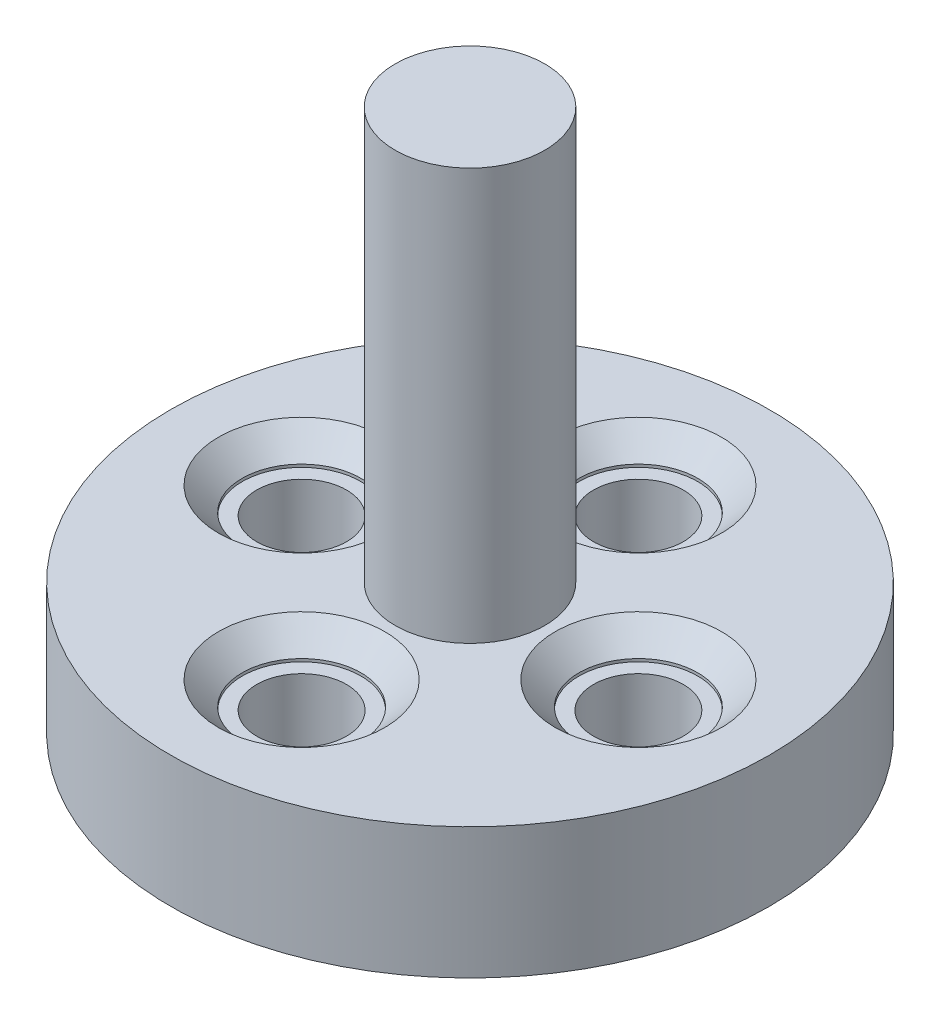
ISO-10303-21;
HEADER;
FILE_DESCRIPTION(('STEP AP214'),'2;1');
FILE_NAME('part.step','',(''),(''),'','','');
FILE_SCHEMA(('AUTOMOTIVE_DESIGN { 1 0 10303 214 1 1 1 1 }'));
ENDSEC;
DATA;
#1=APPLICATION_CONTEXT('core data for automotive mechanical design processes');
#2=APPLICATION_PROTOCOL_DEFINITION('international standard','automotive_design',2000,#1);
#3=PRODUCT_CONTEXT('',#1,'mechanical');
#4=PRODUCT('Part','Part','',(#3));
#5=PRODUCT_RELATED_PRODUCT_CATEGORY('part','',(#4));
#6=PRODUCT_DEFINITION_FORMATION('','',#4);
#7=PRODUCT_DEFINITION_CONTEXT('part definition',#1,'design');
#8=PRODUCT_DEFINITION('design','',#6,#7);
#9=PRODUCT_DEFINITION_SHAPE('','',#8);
#10=(LENGTH_UNIT() NAMED_UNIT(*) SI_UNIT(.MILLI.,.METRE.));
#11=(NAMED_UNIT(*) PLANE_ANGLE_UNIT() SI_UNIT($,.RADIAN.));
#12=(NAMED_UNIT(*) SI_UNIT($,.STERADIAN.) SOLID_ANGLE_UNIT());
#13=UNCERTAINTY_MEASURE_WITH_UNIT(LENGTH_MEASURE(1.E-05),#10,'distance_accuracy_value','');
#14=(GEOMETRIC_REPRESENTATION_CONTEXT(3) GLOBAL_UNCERTAINTY_ASSIGNED_CONTEXT((#13)) GLOBAL_UNIT_ASSIGNED_CONTEXT((#10,
#11,#12)) REPRESENTATION_CONTEXT('',''));
#15=CARTESIAN_POINT('',(0.,0.,0.));
#16=DIRECTION('',(0.,0.,1.));
#17=DIRECTION('',(1.,0.,0.));
#18=AXIS2_PLACEMENT_3D('',#15,#16,#17);
#19=CARTESIAN_POINT('',(-3.81373626373626,6.85,0.));
#20=DIRECTION('',(0.,-1.,0.));
#21=DIRECTION('',(1.,0.,0.));
#22=AXIS2_PLACEMENT_3D('',#19,#20,#21);
#23=PLANE('',#22);
#24=CARTESIAN_POINT('',(-5.81373626373626,6.85,0.));
#25=DIRECTION('',(0.,1.,0.));
#26=DIRECTION('',(-1.,0.,0.));
#27=AXIS2_PLACEMENT_3D('',#24,#25,#26);
#28=CIRCLE('',#27,2.);
#29=CARTESIAN_POINT('',(-7.81373626373626,6.85,0.));
#30=VERTEX_POINT('',#29);
#31=EDGE_CURVE('E113',#30,#30,#28,.T.);
#32=ORIENTED_EDGE('',*,*,#31,.T.);
#33=EDGE_LOOP('',(#32));
#34=FACE_BOUND('',#33,.T.);
#35=ADVANCED_FACE('F42',(#34),#23,.F.);
#36=CARTESIAN_POINT('',(-5.81373626373626,-7.65,0.));
#37=DIRECTION('',(0.,1.,0.));
#38=DIRECTION('',(-1.,0.,0.));
#39=AXIS2_PLACEMENT_3D('',#36,#37,#38);
#40=PLANE('',#39);
#41=CARTESIAN_POINT('',(-5.81373626373626,-7.65,0.));
#42=DIRECTION('',(0.,-1.,0.));
#43=DIRECTION('',(1.,0.,0.));
#44=AXIS2_PLACEMENT_3D('',#41,#42,#43);
#45=CIRCLE('',#44,1.26674120256926);
#46=CARTESIAN_POINT('',(-4.546995061167,-7.65,0.));
#47=VERTEX_POINT('',#46);
#48=EDGE_CURVE('E220',#47,#47,#45,.T.);
#49=ORIENTED_EDGE('',*,*,#48,.F.);
#50=EDGE_LOOP('',(#49));
#51=FACE_BOUND('',#50,.T.);
#52=CARTESIAN_POINT('',(-10.3137362637363,-7.65,0.));
#53=DIRECTION('',(0.,1.,0.));
#54=DIRECTION('',(-1.,0.,0.));
#55=AXIS2_PLACEMENT_3D('',#52,#53,#54);
#56=CIRCLE('',#55,1.2);
#57=CARTESIAN_POINT('',(-11.5137362637363,-7.65,0.));
#58=VERTEX_POINT('',#57);
#59=EDGE_CURVE('E62',#58,#58,#56,.T.);
#60=ORIENTED_EDGE('',*,*,#59,.T.);
#61=EDGE_LOOP('',(#60));
#62=FACE_BOUND('',#61,.T.);
#63=CARTESIAN_POINT('',(-5.81373626373626,-7.65,-4.5));
#64=DIRECTION('',(0.,1.,0.));
#65=DIRECTION('',(-1.,0.,0.));
#66=AXIS2_PLACEMENT_3D('',#63,#64,#65);
#67=CIRCLE('',#66,1.2);
#68=CARTESIAN_POINT('',(-7.01373626373626,-7.65,-4.5));
#69=VERTEX_POINT('',#68);
#70=EDGE_CURVE('E229',#69,#69,#67,.T.);
#71=ORIENTED_EDGE('',*,*,#70,.T.);
#72=EDGE_LOOP('',(#71));
#73=FACE_BOUND('',#72,.T.);
#74=CARTESIAN_POINT('',(-1.31373626373626,-7.65,0.));
#75=DIRECTION('',(0.,1.,0.));
#76=DIRECTION('',(-1.,0.,0.));
#77=AXIS2_PLACEMENT_3D('',#74,#75,#76);
#78=CIRCLE('',#77,1.2);
#79=CARTESIAN_POINT('',(-2.51373626373626,-7.65,0.));
#80=VERTEX_POINT('',#79);
#81=EDGE_CURVE('E223',#80,#80,#78,.T.);
#82=ORIENTED_EDGE('',*,*,#81,.T.);
#83=EDGE_LOOP('',(#82));
#84=FACE_BOUND('',#83,.T.);
#85=CARTESIAN_POINT('',(-5.81373626373626,-7.65,4.5));
#86=DIRECTION('',(0.,1.,0.));
#87=DIRECTION('',(-1.,0.,0.));
#88=AXIS2_PLACEMENT_3D('',#85,#86,#87);
#89=CIRCLE('',#88,1.2);
#90=CARTESIAN_POINT('',(-7.01373626373626,-7.65,4.5));
#91=VERTEX_POINT('',#90);
#92=EDGE_CURVE('E81',#91,#91,#89,.T.);
#93=ORIENTED_EDGE('',*,*,#92,.T.);
#94=EDGE_LOOP('',(#93));
#95=FACE_BOUND('',#94,.T.);
#96=CARTESIAN_POINT('',(-5.81373626373626,-7.65,0.));
#97=DIRECTION('',(0.,1.,0.));
#98=DIRECTION('',(-1.,0.,0.));
#99=AXIS2_PLACEMENT_3D('',#96,#97,#98);
#100=CIRCLE('',#99,8.);
#101=CARTESIAN_POINT('',(-13.8137362637363,-7.65,0.));
#102=VERTEX_POINT('',#101);
#103=EDGE_CURVE('E10',#102,#102,#100,.T.);
#104=ORIENTED_EDGE('',*,*,#103,.F.);
#105=EDGE_LOOP('',(#104));
#106=FACE_BOUND('',#105,.T.);
#107=ADVANCED_FACE('F129',(#51,#62,#73,#84,#95,#106),#40,.F.);
#108=CARTESIAN_POINT('',(-5.81373626373626,6.85,0.));
#109=DIRECTION('',(0.,1.,0.));
#110=DIRECTION('',(-1.,0.,0.));
#111=AXIS2_PLACEMENT_3D('',#108,#109,#110);
#112=CYLINDRICAL_SURFACE('',#111,8.);
#113=CARTESIAN_POINT('',(-5.81373626373626,-4.15,0.));
#114=DIRECTION('',(0.,1.,0.));
#115=DIRECTION('',(-1.,0.,0.));
#116=AXIS2_PLACEMENT_3D('',#113,#114,#115);
#117=CIRCLE('',#116,8.);
#118=CARTESIAN_POINT('',(-13.8137362637363,-4.15,0.));
#119=VERTEX_POINT('',#118);
#120=EDGE_CURVE('E49',#119,#119,#117,.T.);
#121=ORIENTED_EDGE('',*,*,#120,.F.);
#122=EDGE_LOOP('',(#121));
#123=FACE_BOUND('',#122,.T.);
#124=ORIENTED_EDGE('',*,*,#103,.T.);
#125=EDGE_LOOP('',(#124));
#126=FACE_BOUND('',#125,.T.);
#127=ADVANCED_FACE('F123',(#123,#126),#112,.T.);
#128=CARTESIAN_POINT('',(2.18626373626374,-4.15,0.));
#129=DIRECTION('',(0.,-1.,0.));
#130=DIRECTION('',(1.,0.,0.));
#131=AXIS2_PLACEMENT_3D('',#128,#129,#130);
#132=PLANE('',#131);
#133=CARTESIAN_POINT('',(-10.3137362637363,-4.15,0.));
#134=DIRECTION('',(0.,1.,0.));
#135=DIRECTION('',(0.,0.,1.));
#136=AXIS2_PLACEMENT_3D('',#133,#134,#135);
#137=CIRCLE('',#136,2.2225);
#138=CARTESIAN_POINT('',(-10.3137362637363,-4.15,2.2225));
#139=VERTEX_POINT('',#138);
#140=EDGE_CURVE('E69',#139,#139,#137,.T.);
#141=ORIENTED_EDGE('',*,*,#140,.F.);
#142=EDGE_LOOP('',(#141));
#143=FACE_BOUND('',#142,.T.);
#144=CARTESIAN_POINT('',(-5.81373626373626,-4.15,-4.5));
#145=DIRECTION('',(0.,1.,0.));
#146=DIRECTION('',(0.,0.,1.));
#147=AXIS2_PLACEMENT_3D('',#144,#145,#146);
#148=CIRCLE('',#147,2.2225);
#149=CARTESIAN_POINT('',(-5.81373626373626,-4.15,-2.2775));
#150=VERTEX_POINT('',#149);
#151=EDGE_CURVE('E86',#150,#150,#148,.T.);
#152=ORIENTED_EDGE('',*,*,#151,.F.);
#153=EDGE_LOOP('',(#152));
#154=FACE_BOUND('',#153,.T.);
#155=CARTESIAN_POINT('',(-1.31373626373626,-4.15,0.));
#156=DIRECTION('',(0.,1.,0.));
#157=DIRECTION('',(0.,0.,1.));
#158=AXIS2_PLACEMENT_3D('',#155,#156,#157);
#159=CIRCLE('',#158,2.2225);
#160=CARTESIAN_POINT('',(-1.31373626373626,-4.15,2.2225));
#161=VERTEX_POINT('',#160);
#162=EDGE_CURVE('E95',#161,#161,#159,.T.);
#163=ORIENTED_EDGE('',*,*,#162,.F.);
#164=EDGE_LOOP('',(#163));
#165=FACE_BOUND('',#164,.T.);
#166=CARTESIAN_POINT('',(-5.81373626373626,-4.15,4.5));
#167=DIRECTION('',(0.,1.,0.));
#168=DIRECTION('',(0.,0.,1.));
#169=AXIS2_PLACEMENT_3D('',#166,#167,#168);
#170=CIRCLE('',#169,2.2225);
#171=CARTESIAN_POINT('',(-5.81373626373626,-4.15,6.7225));
#172=VERTEX_POINT('',#171);
#173=EDGE_CURVE('E104',#172,#172,#170,.T.);
#174=ORIENTED_EDGE('',*,*,#173,.F.);
#175=EDGE_LOOP('',(#174));
#176=FACE_BOUND('',#175,.T.);
#177=CARTESIAN_POINT('',(-5.81373626373626,-4.15,0.));
#178=DIRECTION('',(0.,1.,0.));
#179=DIRECTION('',(-1.,0.,0.));
#180=AXIS2_PLACEMENT_3D('',#177,#178,#179);
#181=CIRCLE('',#180,2.);
#182=CARTESIAN_POINT('',(-7.81373626373626,-4.15,0.));
#183=VERTEX_POINT('',#182);
#184=EDGE_CURVE('E54',#183,#183,#181,.T.);
#185=ORIENTED_EDGE('',*,*,#184,.F.);
#186=EDGE_LOOP('',(#185));
#187=FACE_BOUND('',#186,.T.);
#188=ORIENTED_EDGE('',*,*,#120,.T.);
#189=EDGE_LOOP('',(#188));
#190=FACE_BOUND('',#189,.T.);
#191=ADVANCED_FACE('F120',(#143,#154,#165,#176,#187,#190),#132,.F.);
#192=CARTESIAN_POINT('',(-5.81373626373626,6.85,0.));
#193=DIRECTION('',(0.,1.,0.));
#194=DIRECTION('',(-1.,0.,0.));
#195=AXIS2_PLACEMENT_3D('',#192,#193,#194);
#196=CYLINDRICAL_SURFACE('',#195,2.);
#197=ORIENTED_EDGE('',*,*,#31,.F.);
#198=EDGE_LOOP('',(#197));
#199=FACE_BOUND('',#198,.T.);
#200=ORIENTED_EDGE('',*,*,#184,.T.);
#201=EDGE_LOOP('',(#200));
#202=FACE_BOUND('',#201,.T.);
#203=ADVANCED_FACE('F118',(#199,#202),#196,.T.);
#204=CARTESIAN_POINT('',(-5.11523626373626,-4.8612,4.5));
#205=DIRECTION('',(0.,-1.,0.));
#206=DIRECTION('',(0.,0.,-1.));
#207=AXIS2_PLACEMENT_3D('',#204,#205,#206);
#208=PLANE('',#207);
#209=CARTESIAN_POINT('',(-5.81373626373626,-4.8612,4.5));
#210=DIRECTION('',(0.,-1.,0.));
#211=DIRECTION('',(0.,0.,-1.));
#212=AXIS2_PLACEMENT_3D('',#209,#210,#211);
#213=CIRCLE('',#212,1.2);
#214=CARTESIAN_POINT('',(-7.01373626373626,-4.8612,4.5));
#215=VERTEX_POINT('',#214);
#216=EDGE_CURVE('E45',#215,#215,#213,.T.);
#217=ORIENTED_EDGE('',*,*,#216,.T.);
#218=EDGE_LOOP('',(#217));
#219=FACE_BOUND('',#218,.T.);
#220=CARTESIAN_POINT('',(-5.81373626373626,-4.8612,4.5));
#221=DIRECTION('',(0.,1.,0.));
#222=DIRECTION('',(0.,0.,1.));
#223=AXIS2_PLACEMENT_3D('',#220,#221,#222);
#224=CIRCLE('',#223,1.5875);
#225=CARTESIAN_POINT('',(-5.81373626373626,-4.8612,6.0875));
#226=VERTEX_POINT('',#225);
#227=EDGE_CURVE('E110',#226,#226,#224,.T.);
#228=ORIENTED_EDGE('',*,*,#227,.T.);
#229=EDGE_LOOP('',(#228));
#230=FACE_BOUND('',#229,.T.);
#231=ADVANCED_FACE('F142',(#219,#230),#208,.F.);
#232=CARTESIAN_POINT('',(-5.81373626373626,-4.15,4.5));
#233=DIRECTION('',(0.,1.,0.));
#234=DIRECTION('',(0.,0.,1.));
#235=AXIS2_PLACEMENT_3D('',#232,#233,#234);
#236=CYLINDRICAL_SURFACE('',#235,1.5875);
#237=ORIENTED_EDGE('',*,*,#227,.F.);
#238=EDGE_LOOP('',(#237));
#239=FACE_BOUND('',#238,.T.);
#240=CARTESIAN_POINT('',(-5.81373626373626,-4.785,4.5));
#241=DIRECTION('',(0.,1.,0.));
#242=DIRECTION('',(0.,0.,1.));
#243=AXIS2_PLACEMENT_3D('',#240,#241,#242);
#244=CIRCLE('',#243,1.5875);
#245=CARTESIAN_POINT('',(-5.81373626373626,-4.785,6.0875));
#246=VERTEX_POINT('',#245);
#247=EDGE_CURVE('E107',#246,#246,#244,.T.);
#248=ORIENTED_EDGE('',*,*,#247,.T.);
#249=EDGE_LOOP('',(#248));
#250=FACE_BOUND('',#249,.T.);
#251=ADVANCED_FACE('F147',(#239,#250),#236,.F.);
#252=CARTESIAN_POINT('',(-5.81373626373626,-4.15,4.5));
#253=DIRECTION('',(0.,1.,0.));
#254=DIRECTION('',(0.,0.,1.));
#255=AXIS2_PLACEMENT_3D('',#252,#253,#254);
#256=CONICAL_SURFACE('',#255,2.2225,0.785398163397448);
#257=ORIENTED_EDGE('',*,*,#247,.F.);
#258=EDGE_LOOP('',(#257));
#259=FACE_BOUND('',#258,.T.);
#260=ORIENTED_EDGE('',*,*,#173,.T.);
#261=EDGE_LOOP('',(#260));
#262=FACE_BOUND('',#261,.T.);
#263=ADVANCED_FACE('F152',(#259,#262),#256,.F.);
#264=CARTESIAN_POINT('',(-0.615236263736261,-4.8612,0.));
#265=DIRECTION('',(0.,-1.,0.));
#266=DIRECTION('',(0.,0.,-1.));
#267=AXIS2_PLACEMENT_3D('',#264,#265,#266);
#268=PLANE('',#267);
#269=CARTESIAN_POINT('',(-1.31373626373626,-4.8612,0.));
#270=DIRECTION('',(0.,-1.,0.));
#271=DIRECTION('',(0.,0.,-1.));
#272=AXIS2_PLACEMENT_3D('',#269,#270,#271);
#273=CIRCLE('',#272,1.2);
#274=CARTESIAN_POINT('',(-2.51373626373626,-4.8612,0.));
#275=VERTEX_POINT('',#274);
#276=EDGE_CURVE('E64',#275,#275,#273,.T.);
#277=ORIENTED_EDGE('',*,*,#276,.T.);
#278=EDGE_LOOP('',(#277));
#279=FACE_BOUND('',#278,.T.);
#280=CARTESIAN_POINT('',(-1.31373626373626,-4.8612,0.));
#281=DIRECTION('',(0.,1.,0.));
#282=DIRECTION('',(0.,0.,1.));
#283=AXIS2_PLACEMENT_3D('',#280,#281,#282);
#284=CIRCLE('',#283,1.5875);
#285=CARTESIAN_POINT('',(-1.31373626373626,-4.8612,1.5875));
#286=VERTEX_POINT('',#285);
#287=EDGE_CURVE('E101',#286,#286,#284,.T.);
#288=ORIENTED_EDGE('',*,*,#287,.T.);
#289=EDGE_LOOP('',(#288));
#290=FACE_BOUND('',#289,.T.);
#291=ADVANCED_FACE('F156',(#279,#290),#268,.F.);
#292=CARTESIAN_POINT('',(-1.31373626373626,-4.15,0.));
#293=DIRECTION('',(0.,1.,0.));
#294=DIRECTION('',(0.,0.,1.));
#295=AXIS2_PLACEMENT_3D('',#292,#293,#294);
#296=CYLINDRICAL_SURFACE('',#295,1.5875);
#297=ORIENTED_EDGE('',*,*,#287,.F.);
#298=EDGE_LOOP('',(#297));
#299=FACE_BOUND('',#298,.T.);
#300=CARTESIAN_POINT('',(-1.31373626373626,-4.785,0.));
#301=DIRECTION('',(0.,1.,0.));
#302=DIRECTION('',(0.,0.,1.));
#303=AXIS2_PLACEMENT_3D('',#300,#301,#302);
#304=CIRCLE('',#303,1.5875);
#305=CARTESIAN_POINT('',(-1.31373626373626,-4.785,1.5875));
#306=VERTEX_POINT('',#305);
#307=EDGE_CURVE('E98',#306,#306,#304,.T.);
#308=ORIENTED_EDGE('',*,*,#307,.T.);
#309=EDGE_LOOP('',(#308));
#310=FACE_BOUND('',#309,.T.);
#311=ADVANCED_FACE('F160',(#299,#310),#296,.F.);
#312=CARTESIAN_POINT('',(-1.31373626373626,-4.15,0.));
#313=DIRECTION('',(0.,1.,0.));
#314=DIRECTION('',(0.,0.,1.));
#315=AXIS2_PLACEMENT_3D('',#312,#313,#314);
#316=CONICAL_SURFACE('',#315,2.2225,0.785398163397448);
#317=ORIENTED_EDGE('',*,*,#307,.F.);
#318=EDGE_LOOP('',(#317));
#319=FACE_BOUND('',#318,.T.);
#320=ORIENTED_EDGE('',*,*,#162,.T.);
#321=EDGE_LOOP('',(#320));
#322=FACE_BOUND('',#321,.T.);
#323=ADVANCED_FACE('F163',(#319,#322),#316,.F.);
#324=CARTESIAN_POINT('',(-5.11523626373626,-4.8612,-4.5));
#325=DIRECTION('',(0.,-1.,0.));
#326=DIRECTION('',(0.,0.,-1.));
#327=AXIS2_PLACEMENT_3D('',#324,#325,#326);
#328=PLANE('',#327);
#329=CARTESIAN_POINT('',(-5.81373626373626,-4.8612,-4.5));
#330=DIRECTION('',(0.,-1.,0.));
#331=DIRECTION('',(0.,0.,-1.));
#332=AXIS2_PLACEMENT_3D('',#329,#330,#331);
#333=CIRCLE('',#332,1.2);
#334=CARTESIAN_POINT('',(-7.01373626373626,-4.8612,-4.5));
#335=VERTEX_POINT('',#334);
#336=EDGE_CURVE('E61',#335,#335,#333,.T.);
#337=ORIENTED_EDGE('',*,*,#336,.T.);
#338=EDGE_LOOP('',(#337));
#339=FACE_BOUND('',#338,.T.);
#340=CARTESIAN_POINT('',(-5.81373626373626,-4.8612,-4.5));
#341=DIRECTION('',(0.,1.,0.));
#342=DIRECTION('',(0.,0.,1.));
#343=AXIS2_PLACEMENT_3D('',#340,#341,#342);
#344=CIRCLE('',#343,1.5875);
#345=CARTESIAN_POINT('',(-5.81373626373626,-4.8612,-2.9125));
#346=VERTEX_POINT('',#345);
#347=EDGE_CURVE('E92',#346,#346,#344,.T.);
#348=ORIENTED_EDGE('',*,*,#347,.T.);
#349=EDGE_LOOP('',(#348));
#350=FACE_BOUND('',#349,.T.);
#351=ADVANCED_FACE('F167',(#339,#350),#328,.F.);
#352=CARTESIAN_POINT('',(-5.81373626373626,-4.15,-4.5));
#353=DIRECTION('',(0.,1.,0.));
#354=DIRECTION('',(0.,0.,1.));
#355=AXIS2_PLACEMENT_3D('',#352,#353,#354);
#356=CYLINDRICAL_SURFACE('',#355,1.5875);
#357=ORIENTED_EDGE('',*,*,#347,.F.);
#358=EDGE_LOOP('',(#357));
#359=FACE_BOUND('',#358,.T.);
#360=CARTESIAN_POINT('',(-5.81373626373626,-4.785,-4.5));
#361=DIRECTION('',(0.,1.,0.));
#362=DIRECTION('',(0.,0.,1.));
#363=AXIS2_PLACEMENT_3D('',#360,#361,#362);
#364=CIRCLE('',#363,1.5875);
#365=CARTESIAN_POINT('',(-5.81373626373626,-4.785,-2.9125));
#366=VERTEX_POINT('',#365);
#367=EDGE_CURVE('E89',#366,#366,#364,.T.);
#368=ORIENTED_EDGE('',*,*,#367,.T.);
#369=EDGE_LOOP('',(#368));
#370=FACE_BOUND('',#369,.T.);
#371=ADVANCED_FACE('F171',(#359,#370),#356,.F.);
#372=CARTESIAN_POINT('',(-5.81373626373626,-4.15,-4.5));
#373=DIRECTION('',(0.,1.,0.));
#374=DIRECTION('',(0.,0.,1.));
#375=AXIS2_PLACEMENT_3D('',#372,#373,#374);
#376=CONICAL_SURFACE('',#375,2.2225,0.785398163397448);
#377=ORIENTED_EDGE('',*,*,#367,.F.);
#378=EDGE_LOOP('',(#377));
#379=FACE_BOUND('',#378,.T.);
#380=ORIENTED_EDGE('',*,*,#151,.T.);
#381=EDGE_LOOP('',(#380));
#382=FACE_BOUND('',#381,.T.);
#383=ADVANCED_FACE('F175',(#379,#382),#376,.F.);
#384=CARTESIAN_POINT('',(-9.61523626373626,-4.8612,0.));
#385=DIRECTION('',(0.,-1.,0.));
#386=DIRECTION('',(0.,0.,-1.));
#387=AXIS2_PLACEMENT_3D('',#384,#385,#386);
#388=PLANE('',#387);
#389=CARTESIAN_POINT('',(-10.3137362637363,-4.8612,0.));
#390=DIRECTION('',(0.,-1.,0.));
#391=DIRECTION('',(0.,0.,-1.));
#392=AXIS2_PLACEMENT_3D('',#389,#390,#391);
#393=CIRCLE('',#392,1.2);
#394=CARTESIAN_POINT('',(-11.5137362637363,-4.8612,0.));
#395=VERTEX_POINT('',#394);
#396=EDGE_CURVE('E58',#395,#395,#393,.T.);
#397=ORIENTED_EDGE('',*,*,#396,.T.);
#398=EDGE_LOOP('',(#397));
#399=FACE_BOUND('',#398,.T.);
#400=CARTESIAN_POINT('',(-10.3137362637363,-4.8612,0.));
#401=DIRECTION('',(0.,1.,0.));
#402=DIRECTION('',(0.,0.,1.));
#403=AXIS2_PLACEMENT_3D('',#400,#401,#402);
#404=CIRCLE('',#403,1.5875);
#405=CARTESIAN_POINT('',(-10.3137362637363,-4.8612,1.5875));
#406=VERTEX_POINT('',#405);
#407=EDGE_CURVE('E78',#406,#406,#404,.T.);
#408=ORIENTED_EDGE('',*,*,#407,.T.);
#409=EDGE_LOOP('',(#408));
#410=FACE_BOUND('',#409,.T.);
#411=ADVANCED_FACE('F179',(#399,#410),#388,.F.);
#412=CARTESIAN_POINT('',(-10.3137362637363,-4.15,0.));
#413=DIRECTION('',(0.,1.,0.));
#414=DIRECTION('',(0.,0.,1.));
#415=AXIS2_PLACEMENT_3D('',#412,#413,#414);
#416=CYLINDRICAL_SURFACE('',#415,1.5875);
#417=ORIENTED_EDGE('',*,*,#407,.F.);
#418=EDGE_LOOP('',(#417));
#419=FACE_BOUND('',#418,.T.);
#420=CARTESIAN_POINT('',(-10.3137362637363,-4.785,0.));
#421=DIRECTION('',(0.,1.,0.));
#422=DIRECTION('',(0.,0.,1.));
#423=AXIS2_PLACEMENT_3D('',#420,#421,#422);
#424=CIRCLE('',#423,1.5875);
#425=CARTESIAN_POINT('',(-10.3137362637363,-4.785,1.5875));
#426=VERTEX_POINT('',#425);
#427=EDGE_CURVE('E73',#426,#426,#424,.T.);
#428=ORIENTED_EDGE('',*,*,#427,.T.);
#429=EDGE_LOOP('',(#428));
#430=FACE_BOUND('',#429,.T.);
#431=ADVANCED_FACE('F183',(#419,#430),#416,.F.);
#432=CARTESIAN_POINT('',(-10.3137362637363,-4.15,0.));
#433=DIRECTION('',(0.,1.,0.));
#434=DIRECTION('',(0.,0.,1.));
#435=AXIS2_PLACEMENT_3D('',#432,#433,#434);
#436=CONICAL_SURFACE('',#435,2.2225,0.785398163397448);
#437=ORIENTED_EDGE('',*,*,#427,.F.);
#438=EDGE_LOOP('',(#437));
#439=FACE_BOUND('',#438,.T.);
#440=ORIENTED_EDGE('',*,*,#140,.T.);
#441=EDGE_LOOP('',(#440));
#442=FACE_BOUND('',#441,.T.);
#443=ADVANCED_FACE('F187',(#439,#442),#436,.F.);
#444=CARTESIAN_POINT('',(-10.3137362637363,-7.65,0.));
#445=DIRECTION('',(0.,1.,0.));
#446=DIRECTION('',(-1.,0.,0.));
#447=AXIS2_PLACEMENT_3D('',#444,#445,#446);
#448=CYLINDRICAL_SURFACE('',#447,1.2);
#449=CARTESIAN_POINT('',(-11.5137362637363,-7.65,0.));
#450=CARTESIAN_POINT('',(-11.5137362637363,-7.62095,0.));
#451=CARTESIAN_POINT('',(-11.5137362637363,-7.5919,0.));
#452=CARTESIAN_POINT('',(-11.5137362637363,-7.5338,0.));
#453=CARTESIAN_POINT('',(-11.5137362637363,-7.50475,0.));
#454=CARTESIAN_POINT('',(-11.5137362637363,-7.44665,0.));
#455=CARTESIAN_POINT('',(-11.5137362637363,-7.4176,0.));
#456=CARTESIAN_POINT('',(-11.5137362637363,-7.3595,0.));
#457=CARTESIAN_POINT('',(-11.5137362637363,-7.33045,0.));
#458=CARTESIAN_POINT('',(-11.5137362637363,-7.27235,0.));
#459=CARTESIAN_POINT('',(-11.5137362637363,-7.2433,0.));
#460=CARTESIAN_POINT('',(-11.5137362637363,-7.1852,0.));
#461=CARTESIAN_POINT('',(-11.5137362637363,-7.15615,0.));
#462=CARTESIAN_POINT('',(-11.5137362637363,-7.09805,0.));
#463=CARTESIAN_POINT('',(-11.5137362637363,-7.069,0.));
#464=CARTESIAN_POINT('',(-11.5137362637363,-7.0109,0.));
#465=CARTESIAN_POINT('',(-11.5137362637363,-6.98185,0.));
#466=CARTESIAN_POINT('',(-11.5137362637363,-6.92375,0.));
#467=CARTESIAN_POINT('',(-11.5137362637363,-6.8947,0.));
#468=CARTESIAN_POINT('',(-11.5137362637363,-6.8366,0.));
#469=CARTESIAN_POINT('',(-11.5137362637363,-6.80755,0.));
#470=CARTESIAN_POINT('',(-11.5137362637363,-6.74945,0.));
#471=CARTESIAN_POINT('',(-11.5137362637363,-6.7204,0.));
#472=CARTESIAN_POINT('',(-11.5137362637363,-6.6623,0.));
#473=CARTESIAN_POINT('',(-11.5137362637363,-6.63325,0.));
#474=CARTESIAN_POINT('',(-11.5137362637363,-6.57515,0.));
#475=CARTESIAN_POINT('',(-11.5137362637363,-6.5461,0.));
#476=CARTESIAN_POINT('',(-11.5137362637363,-6.488,0.));
#477=CARTESIAN_POINT('',(-11.5137362637363,-6.45895,0.));
#478=CARTESIAN_POINT('',(-11.5137362637363,-6.40085,0.));
#479=CARTESIAN_POINT('',(-11.5137362637363,-6.3718,0.));
#480=CARTESIAN_POINT('',(-11.5137362637363,-6.3137,0.));
#481=CARTESIAN_POINT('',(-11.5137362637363,-6.28465,0.));
#482=CARTESIAN_POINT('',(-11.5137362637363,-6.22655,0.));
#483=CARTESIAN_POINT('',(-11.5137362637363,-6.1975,0.));
#484=CARTESIAN_POINT('',(-11.5137362637363,-6.1394,0.));
#485=CARTESIAN_POINT('',(-11.5137362637363,-6.11035,0.));
#486=CARTESIAN_POINT('',(-11.5137362637363,-6.05225,0.));
#487=CARTESIAN_POINT('',(-11.5137362637363,-6.0232,0.));
#488=CARTESIAN_POINT('',(-11.5137362637363,-5.9651,0.));
#489=CARTESIAN_POINT('',(-11.5137362637363,-5.93605,0.));
#490=CARTESIAN_POINT('',(-11.5137362637363,-5.87795,0.));
#491=CARTESIAN_POINT('',(-11.5137362637363,-5.8489,0.));
#492=CARTESIAN_POINT('',(-11.5137362637363,-5.7908,0.));
#493=CARTESIAN_POINT('',(-11.5137362637363,-5.76175,0.));
#494=CARTESIAN_POINT('',(-11.5137362637363,-5.70365,0.));
#495=CARTESIAN_POINT('',(-11.5137362637363,-5.6746,0.));
#496=CARTESIAN_POINT('',(-11.5137362637363,-5.6165,0.));
#497=CARTESIAN_POINT('',(-11.5137362637363,-5.58745,0.));
#498=CARTESIAN_POINT('',(-11.5137362637363,-5.52935,0.));
#499=CARTESIAN_POINT('',(-11.5137362637363,-5.5003,0.));
#500=CARTESIAN_POINT('',(-11.5137362637363,-5.4422,0.));
#501=CARTESIAN_POINT('',(-11.5137362637363,-5.41315,0.));
#502=CARTESIAN_POINT('',(-11.5137362637363,-5.35505,0.));
#503=CARTESIAN_POINT('',(-11.5137362637363,-5.326,0.));
#504=CARTESIAN_POINT('',(-11.5137362637363,-5.2679,0.));
#505=CARTESIAN_POINT('',(-11.5137362637363,-5.23885,0.));
#506=CARTESIAN_POINT('',(-11.5137362637363,-5.18075,0.));
#507=CARTESIAN_POINT('',(-11.5137362637363,-5.1517,0.));
#508=CARTESIAN_POINT('',(-11.5137362637363,-5.0936,0.));
#509=CARTESIAN_POINT('',(-11.5137362637363,-5.06455,0.));
#510=CARTESIAN_POINT('',(-11.5137362637363,-5.00645,0.));
#511=CARTESIAN_POINT('',(-11.5137362637363,-4.9774,0.));
#512=CARTESIAN_POINT('',(-11.5137362637363,-4.9193,0.));
#513=CARTESIAN_POINT('',(-11.5137362637363,-4.89025,0.));
#514=CARTESIAN_POINT('',(-11.5137362637363,-4.8612,0.));
#515=B_SPLINE_CURVE_WITH_KNOTS('',3,(#449,#450,#451,#452,#453,#454,#455,#456,#457,#458,#459,
#460,#461,#462,#463,#464,#465,#466,#467,#468,#469,#470,#471,#472,#473,#474,#475,#476,#477,#478,
#479,#480,#481,#482,#483,#484,#485,#486,#487,#488,#489,#490,#491,#492,#493,#494,#495,#496,#497,
#498,#499,#500,#501,#502,#503,#504,#505,#506,#507,#508,#509,#510,#511,#512,#513,#514),
.UNSPECIFIED.,.F.,.F.,(4,2,2,2,2,2,2,2,2,2,2,2,2,2,2,2,2,2,2,2,2,2,2,2,2,2,2,2,2,2,2,2,4),(0.,
0.0871500000000003,0.174300000000001,0.261450000000001,0.348600000000001,0.435750000000001,
0.522900000000001,0.610050000000002,0.697200000000002,0.784350000000001,0.871500000000002,
0.958650000000002,1.0458,1.13295,1.2201,1.30725,1.3944,1.48155,1.5687,1.65585,1.743,1.83015,
1.9173,2.00445,2.0916,2.17875,2.2659,2.35305,2.4402,2.52735,2.6145,2.70165000000001,2.7888),.UNSPECIFIED.);
#516=EDGE_CURVE('BSEAM191',#58,#395,#515,.T.);
#517=ORIENTED_EDGE('',*,*,#59,.F.);
#518=ORIENTED_EDGE('',*,*,#396,.F.);
#519=ORIENTED_EDGE('',*,*,#516,.T.);
#520=ORIENTED_EDGE('',*,*,#516,.F.);
#521=EDGE_LOOP('',(#517,#519,#518,#520));
#522=FACE_BOUND('',#521,.T.);
#523=ADVANCED_FACE('F191',(#522),#448,.F.);
#524=CARTESIAN_POINT('',(-5.81373626373626,-7.65,-4.5));
#525=DIRECTION('',(0.,1.,0.));
#526=DIRECTION('',(-1.,0.,0.));
#527=AXIS2_PLACEMENT_3D('',#524,#525,#526);
#528=CYLINDRICAL_SURFACE('',#527,1.2);
#529=CARTESIAN_POINT('',(-7.01373626373626,-7.65,-4.5));
#530=CARTESIAN_POINT('',(-7.01373626373626,-7.62095,-4.5));
#531=CARTESIAN_POINT('',(-7.01373626373626,-7.5919,-4.5));
#532=CARTESIAN_POINT('',(-7.01373626373626,-7.5338,-4.5));
#533=CARTESIAN_POINT('',(-7.01373626373626,-7.50475,-4.5));
#534=CARTESIAN_POINT('',(-7.01373626373626,-7.44665,-4.5));
#535=CARTESIAN_POINT('',(-7.01373626373626,-7.4176,-4.5));
#536=CARTESIAN_POINT('',(-7.01373626373626,-7.3595,-4.5));
#537=CARTESIAN_POINT('',(-7.01373626373626,-7.33045,-4.5));
#538=CARTESIAN_POINT('',(-7.01373626373626,-7.27235,-4.5));
#539=CARTESIAN_POINT('',(-7.01373626373626,-7.2433,-4.5));
#540=CARTESIAN_POINT('',(-7.01373626373626,-7.1852,-4.5));
#541=CARTESIAN_POINT('',(-7.01373626373626,-7.15615,-4.5));
#542=CARTESIAN_POINT('',(-7.01373626373626,-7.09805,-4.5));
#543=CARTESIAN_POINT('',(-7.01373626373626,-7.069,-4.5));
#544=CARTESIAN_POINT('',(-7.01373626373626,-7.0109,-4.5));
#545=CARTESIAN_POINT('',(-7.01373626373626,-6.98185,-4.5));
#546=CARTESIAN_POINT('',(-7.01373626373626,-6.92375,-4.5));
#547=CARTESIAN_POINT('',(-7.01373626373626,-6.8947,-4.5));
#548=CARTESIAN_POINT('',(-7.01373626373626,-6.8366,-4.5));
#549=CARTESIAN_POINT('',(-7.01373626373626,-6.80755,-4.5));
#550=CARTESIAN_POINT('',(-7.01373626373626,-6.74945,-4.5));
#551=CARTESIAN_POINT('',(-7.01373626373626,-6.7204,-4.5));
#552=CARTESIAN_POINT('',(-7.01373626373626,-6.6623,-4.5));
#553=CARTESIAN_POINT('',(-7.01373626373626,-6.63325,-4.5));
#554=CARTESIAN_POINT('',(-7.01373626373626,-6.57515,-4.5));
#555=CARTESIAN_POINT('',(-7.01373626373626,-6.5461,-4.5));
#556=CARTESIAN_POINT('',(-7.01373626373626,-6.488,-4.5));
#557=CARTESIAN_POINT('',(-7.01373626373626,-6.45895,-4.5));
#558=CARTESIAN_POINT('',(-7.01373626373626,-6.40085,-4.5));
#559=CARTESIAN_POINT('',(-7.01373626373626,-6.3718,-4.5));
#560=CARTESIAN_POINT('',(-7.01373626373626,-6.3137,-4.5));
#561=CARTESIAN_POINT('',(-7.01373626373626,-6.28465,-4.5));
#562=CARTESIAN_POINT('',(-7.01373626373626,-6.22655,-4.5));
#563=CARTESIAN_POINT('',(-7.01373626373626,-6.1975,-4.5));
#564=CARTESIAN_POINT('',(-7.01373626373626,-6.1394,-4.5));
#565=CARTESIAN_POINT('',(-7.01373626373626,-6.11035,-4.5));
#566=CARTESIAN_POINT('',(-7.01373626373626,-6.05225,-4.5));
#567=CARTESIAN_POINT('',(-7.01373626373626,-6.0232,-4.5));
#568=CARTESIAN_POINT('',(-7.01373626373626,-5.9651,-4.5));
#569=CARTESIAN_POINT('',(-7.01373626373626,-5.93605,-4.5));
#570=CARTESIAN_POINT('',(-7.01373626373626,-5.87795,-4.5));
#571=CARTESIAN_POINT('',(-7.01373626373626,-5.8489,-4.5));
#572=CARTESIAN_POINT('',(-7.01373626373626,-5.7908,-4.5));
#573=CARTESIAN_POINT('',(-7.01373626373626,-5.76175,-4.5));
#574=CARTESIAN_POINT('',(-7.01373626373626,-5.70365,-4.5));
#575=CARTESIAN_POINT('',(-7.01373626373626,-5.6746,-4.5));
#576=CARTESIAN_POINT('',(-7.01373626373626,-5.6165,-4.5));
#577=CARTESIAN_POINT('',(-7.01373626373626,-5.58745,-4.5));
#578=CARTESIAN_POINT('',(-7.01373626373626,-5.52935,-4.5));
#579=CARTESIAN_POINT('',(-7.01373626373626,-5.5003,-4.5));
#580=CARTESIAN_POINT('',(-7.01373626373626,-5.4422,-4.5));
#581=CARTESIAN_POINT('',(-7.01373626373626,-5.41315,-4.5));
#582=CARTESIAN_POINT('',(-7.01373626373626,-5.35505,-4.5));
#583=CARTESIAN_POINT('',(-7.01373626373626,-5.326,-4.5));
#584=CARTESIAN_POINT('',(-7.01373626373626,-5.2679,-4.5));
#585=CARTESIAN_POINT('',(-7.01373626373626,-5.23885,-4.5));
#586=CARTESIAN_POINT('',(-7.01373626373626,-5.18075,-4.5));
#587=CARTESIAN_POINT('',(-7.01373626373626,-5.1517,-4.5));
#588=CARTESIAN_POINT('',(-7.01373626373626,-5.0936,-4.5));
#589=CARTESIAN_POINT('',(-7.01373626373626,-5.06455,-4.5));
#590=CARTESIAN_POINT('',(-7.01373626373626,-5.00645,-4.5));
#591=CARTESIAN_POINT('',(-7.01373626373626,-4.9774,-4.5));
#592=CARTESIAN_POINT('',(-7.01373626373626,-4.9193,-4.5));
#593=CARTESIAN_POINT('',(-7.01373626373626,-4.89025,-4.5));
#594=CARTESIAN_POINT('',(-7.01373626373626,-4.8612,-4.5));
#595=B_SPLINE_CURVE_WITH_KNOTS('',3,(#529,#530,#531,#532,#533,#534,#535,#536,#537,#538,#539,
#540,#541,#542,#543,#544,#545,#546,#547,#548,#549,#550,#551,#552,#553,#554,#555,#556,#557,#558,
#559,#560,#561,#562,#563,#564,#565,#566,#567,#568,#569,#570,#571,#572,#573,#574,#575,#576,#577,
#578,#579,#580,#581,#582,#583,#584,#585,#586,#587,#588,#589,#590,#591,#592,#593,#594),
.UNSPECIFIED.,.F.,.F.,(4,2,2,2,2,2,2,2,2,2,2,2,2,2,2,2,2,2,2,2,2,2,2,2,2,2,2,2,2,2,2,2,4),(0.,
0.0871500000000003,0.174300000000001,0.261450000000001,0.348600000000001,0.435750000000001,
0.522900000000001,0.610050000000002,0.697200000000002,0.784350000000001,0.871500000000002,
0.958650000000002,1.0458,1.13295,1.2201,1.30725,1.3944,1.48155,1.5687,1.65585,1.743,1.83015,
1.9173,2.00445,2.0916,2.17875,2.2659,2.35305,2.4402,2.52735,2.6145,2.70165000000001,2.7888),.UNSPECIFIED.);
#596=EDGE_CURVE('BSEAM201',#69,#335,#595,.T.);
#597=ORIENTED_EDGE('',*,*,#70,.F.);
#598=ORIENTED_EDGE('',*,*,#336,.F.);
#599=ORIENTED_EDGE('',*,*,#596,.T.);
#600=ORIENTED_EDGE('',*,*,#596,.F.);
#601=EDGE_LOOP('',(#597,#599,#598,#600));
#602=FACE_BOUND('',#601,.T.);
#603=ADVANCED_FACE('F201',(#602),#528,.F.);
#604=CARTESIAN_POINT('',(-1.31373626373626,-7.65,0.));
#605=DIRECTION('',(0.,1.,0.));
#606=DIRECTION('',(-1.,0.,0.));
#607=AXIS2_PLACEMENT_3D('',#604,#605,#606);
#608=CYLINDRICAL_SURFACE('',#607,1.2);
#609=CARTESIAN_POINT('',(-2.51373626373626,-7.65,0.));
#610=CARTESIAN_POINT('',(-2.51373626373626,-7.62095,0.));
#611=CARTESIAN_POINT('',(-2.51373626373626,-7.5919,0.));
#612=CARTESIAN_POINT('',(-2.51373626373626,-7.5338,0.));
#613=CARTESIAN_POINT('',(-2.51373626373626,-7.50475,0.));
#614=CARTESIAN_POINT('',(-2.51373626373626,-7.44665,0.));
#615=CARTESIAN_POINT('',(-2.51373626373626,-7.4176,0.));
#616=CARTESIAN_POINT('',(-2.51373626373626,-7.3595,0.));
#617=CARTESIAN_POINT('',(-2.51373626373626,-7.33045,0.));
#618=CARTESIAN_POINT('',(-2.51373626373626,-7.27235,0.));
#619=CARTESIAN_POINT('',(-2.51373626373626,-7.2433,0.));
#620=CARTESIAN_POINT('',(-2.51373626373626,-7.1852,0.));
#621=CARTESIAN_POINT('',(-2.51373626373626,-7.15615,0.));
#622=CARTESIAN_POINT('',(-2.51373626373626,-7.09805,0.));
#623=CARTESIAN_POINT('',(-2.51373626373626,-7.069,0.));
#624=CARTESIAN_POINT('',(-2.51373626373626,-7.0109,0.));
#625=CARTESIAN_POINT('',(-2.51373626373626,-6.98185,0.));
#626=CARTESIAN_POINT('',(-2.51373626373626,-6.92375,0.));
#627=CARTESIAN_POINT('',(-2.51373626373626,-6.8947,0.));
#628=CARTESIAN_POINT('',(-2.51373626373626,-6.8366,0.));
#629=CARTESIAN_POINT('',(-2.51373626373626,-6.80755,0.));
#630=CARTESIAN_POINT('',(-2.51373626373626,-6.74945,0.));
#631=CARTESIAN_POINT('',(-2.51373626373626,-6.7204,0.));
#632=CARTESIAN_POINT('',(-2.51373626373626,-6.6623,0.));
#633=CARTESIAN_POINT('',(-2.51373626373626,-6.63325,0.));
#634=CARTESIAN_POINT('',(-2.51373626373626,-6.57515,0.));
#635=CARTESIAN_POINT('',(-2.51373626373626,-6.5461,0.));
#636=CARTESIAN_POINT('',(-2.51373626373626,-6.488,0.));
#637=CARTESIAN_POINT('',(-2.51373626373626,-6.45895,0.));
#638=CARTESIAN_POINT('',(-2.51373626373626,-6.40085,0.));
#639=CARTESIAN_POINT('',(-2.51373626373626,-6.3718,0.));
#640=CARTESIAN_POINT('',(-2.51373626373626,-6.3137,0.));
#641=CARTESIAN_POINT('',(-2.51373626373626,-6.28465,0.));
#642=CARTESIAN_POINT('',(-2.51373626373626,-6.22655,0.));
#643=CARTESIAN_POINT('',(-2.51373626373626,-6.1975,0.));
#644=CARTESIAN_POINT('',(-2.51373626373626,-6.1394,0.));
#645=CARTESIAN_POINT('',(-2.51373626373626,-6.11035,0.));
#646=CARTESIAN_POINT('',(-2.51373626373626,-6.05225,0.));
#647=CARTESIAN_POINT('',(-2.51373626373626,-6.0232,0.));
#648=CARTESIAN_POINT('',(-2.51373626373626,-5.9651,0.));
#649=CARTESIAN_POINT('',(-2.51373626373626,-5.93605,0.));
#650=CARTESIAN_POINT('',(-2.51373626373626,-5.87795,0.));
#651=CARTESIAN_POINT('',(-2.51373626373626,-5.8489,0.));
#652=CARTESIAN_POINT('',(-2.51373626373626,-5.7908,0.));
#653=CARTESIAN_POINT('',(-2.51373626373626,-5.76175,0.));
#654=CARTESIAN_POINT('',(-2.51373626373626,-5.70365,0.));
#655=CARTESIAN_POINT('',(-2.51373626373626,-5.6746,0.));
#656=CARTESIAN_POINT('',(-2.51373626373626,-5.6165,0.));
#657=CARTESIAN_POINT('',(-2.51373626373626,-5.58745,0.));
#658=CARTESIAN_POINT('',(-2.51373626373626,-5.52935,0.));
#659=CARTESIAN_POINT('',(-2.51373626373626,-5.5003,0.));
#660=CARTESIAN_POINT('',(-2.51373626373626,-5.4422,0.));
#661=CARTESIAN_POINT('',(-2.51373626373626,-5.41315,0.));
#662=CARTESIAN_POINT('',(-2.51373626373626,-5.35505,0.));
#663=CARTESIAN_POINT('',(-2.51373626373626,-5.326,0.));
#664=CARTESIAN_POINT('',(-2.51373626373626,-5.2679,0.));
#665=CARTESIAN_POINT('',(-2.51373626373626,-5.23885,0.));
#666=CARTESIAN_POINT('',(-2.51373626373626,-5.18075,0.));
#667=CARTESIAN_POINT('',(-2.51373626373626,-5.1517,0.));
#668=CARTESIAN_POINT('',(-2.51373626373626,-5.0936,0.));
#669=CARTESIAN_POINT('',(-2.51373626373626,-5.06455,0.));
#670=CARTESIAN_POINT('',(-2.51373626373626,-5.00645,0.));
#671=CARTESIAN_POINT('',(-2.51373626373626,-4.9774,0.));
#672=CARTESIAN_POINT('',(-2.51373626373626,-4.9193,0.));
#673=CARTESIAN_POINT('',(-2.51373626373626,-4.89025,0.));
#674=CARTESIAN_POINT('',(-2.51373626373626,-4.8612,0.));
#675=B_SPLINE_CURVE_WITH_KNOTS('',3,(#609,#610,#611,#612,#613,#614,#615,#616,#617,#618,#619,
#620,#621,#622,#623,#624,#625,#626,#627,#628,#629,#630,#631,#632,#633,#634,#635,#636,#637,#638,
#639,#640,#641,#642,#643,#644,#645,#646,#647,#648,#649,#650,#651,#652,#653,#654,#655,#656,#657,
#658,#659,#660,#661,#662,#663,#664,#665,#666,#667,#668,#669,#670,#671,#672,#673,#674),
.UNSPECIFIED.,.F.,.F.,(4,2,2,2,2,2,2,2,2,2,2,2,2,2,2,2,2,2,2,2,2,2,2,2,2,2,2,2,2,2,2,2,4),(0.,
0.0871500000000003,0.174300000000001,0.261450000000001,0.348600000000001,0.435750000000001,
0.522900000000001,0.610050000000002,0.697200000000001,0.784350000000001,0.871500000000002,
0.958650000000002,1.0458,1.13295,1.2201,1.30725,1.3944,1.48155,1.5687,1.65585,1.743,1.83015,
1.9173,2.00445,2.0916,2.17875,2.2659,2.35305,2.4402,2.52735,2.6145,2.70165,2.78880000000001),.UNSPECIFIED.);
#676=EDGE_CURVE('BSEAM197',#80,#275,#675,.T.);
#677=ORIENTED_EDGE('',*,*,#81,.F.);
#678=ORIENTED_EDGE('',*,*,#276,.F.);
#679=ORIENTED_EDGE('',*,*,#676,.T.);
#680=ORIENTED_EDGE('',*,*,#676,.F.);
#681=EDGE_LOOP('',(#677,#679,#678,#680));
#682=FACE_BOUND('',#681,.T.);
#683=ADVANCED_FACE('F197',(#682),#608,.F.);
#684=CARTESIAN_POINT('',(-5.81373626373626,-7.65,4.5));
#685=DIRECTION('',(0.,1.,0.));
#686=DIRECTION('',(-1.,0.,0.));
#687=AXIS2_PLACEMENT_3D('',#684,#685,#686);
#688=CYLINDRICAL_SURFACE('',#687,1.2);
#689=CARTESIAN_POINT('',(-7.01373626373626,-7.65,4.5));
#690=CARTESIAN_POINT('',(-7.01373626373626,-7.62095,4.5));
#691=CARTESIAN_POINT('',(-7.01373626373626,-7.5919,4.5));
#692=CARTESIAN_POINT('',(-7.01373626373626,-7.5338,4.5));
#693=CARTESIAN_POINT('',(-7.01373626373626,-7.50475,4.5));
#694=CARTESIAN_POINT('',(-7.01373626373626,-7.44665,4.5));
#695=CARTESIAN_POINT('',(-7.01373626373626,-7.4176,4.5));
#696=CARTESIAN_POINT('',(-7.01373626373626,-7.3595,4.5));
#697=CARTESIAN_POINT('',(-7.01373626373626,-7.33045,4.5));
#698=CARTESIAN_POINT('',(-7.01373626373626,-7.27235,4.5));
#699=CARTESIAN_POINT('',(-7.01373626373626,-7.2433,4.5));
#700=CARTESIAN_POINT('',(-7.01373626373626,-7.1852,4.5));
#701=CARTESIAN_POINT('',(-7.01373626373626,-7.15615,4.5));
#702=CARTESIAN_POINT('',(-7.01373626373626,-7.09805,4.5));
#703=CARTESIAN_POINT('',(-7.01373626373626,-7.069,4.5));
#704=CARTESIAN_POINT('',(-7.01373626373626,-7.0109,4.5));
#705=CARTESIAN_POINT('',(-7.01373626373626,-6.98185,4.5));
#706=CARTESIAN_POINT('',(-7.01373626373626,-6.92375,4.5));
#707=CARTESIAN_POINT('',(-7.01373626373626,-6.8947,4.5));
#708=CARTESIAN_POINT('',(-7.01373626373626,-6.8366,4.5));
#709=CARTESIAN_POINT('',(-7.01373626373626,-6.80755,4.5));
#710=CARTESIAN_POINT('',(-7.01373626373626,-6.74945,4.5));
#711=CARTESIAN_POINT('',(-7.01373626373626,-6.7204,4.5));
#712=CARTESIAN_POINT('',(-7.01373626373626,-6.6623,4.5));
#713=CARTESIAN_POINT('',(-7.01373626373626,-6.63325,4.5));
#714=CARTESIAN_POINT('',(-7.01373626373626,-6.57515,4.5));
#715=CARTESIAN_POINT('',(-7.01373626373626,-6.5461,4.5));
#716=CARTESIAN_POINT('',(-7.01373626373626,-6.488,4.5));
#717=CARTESIAN_POINT('',(-7.01373626373626,-6.45895,4.5));
#718=CARTESIAN_POINT('',(-7.01373626373626,-6.40085,4.5));
#719=CARTESIAN_POINT('',(-7.01373626373626,-6.3718,4.5));
#720=CARTESIAN_POINT('',(-7.01373626373626,-6.3137,4.5));
#721=CARTESIAN_POINT('',(-7.01373626373626,-6.28465,4.5));
#722=CARTESIAN_POINT('',(-7.01373626373626,-6.22655,4.5));
#723=CARTESIAN_POINT('',(-7.01373626373626,-6.1975,4.5));
#724=CARTESIAN_POINT('',(-7.01373626373626,-6.1394,4.5));
#725=CARTESIAN_POINT('',(-7.01373626373626,-6.11035,4.5));
#726=CARTESIAN_POINT('',(-7.01373626373626,-6.05225,4.5));
#727=CARTESIAN_POINT('',(-7.01373626373626,-6.0232,4.5));
#728=CARTESIAN_POINT('',(-7.01373626373626,-5.9651,4.5));
#729=CARTESIAN_POINT('',(-7.01373626373626,-5.93605,4.5));
#730=CARTESIAN_POINT('',(-7.01373626373626,-5.87795,4.5));
#731=CARTESIAN_POINT('',(-7.01373626373626,-5.8489,4.5));
#732=CARTESIAN_POINT('',(-7.01373626373626,-5.7908,4.5));
#733=CARTESIAN_POINT('',(-7.01373626373626,-5.76175,4.5));
#734=CARTESIAN_POINT('',(-7.01373626373626,-5.70365,4.5));
#735=CARTESIAN_POINT('',(-7.01373626373626,-5.6746,4.5));
#736=CARTESIAN_POINT('',(-7.01373626373626,-5.6165,4.5));
#737=CARTESIAN_POINT('',(-7.01373626373626,-5.58745,4.5));
#738=CARTESIAN_POINT('',(-7.01373626373626,-5.52935,4.5));
#739=CARTESIAN_POINT('',(-7.01373626373626,-5.5003,4.5));
#740=CARTESIAN_POINT('',(-7.01373626373626,-5.4422,4.5));
#741=CARTESIAN_POINT('',(-7.01373626373626,-5.41315,4.5));
#742=CARTESIAN_POINT('',(-7.01373626373626,-5.35505,4.5));
#743=CARTESIAN_POINT('',(-7.01373626373626,-5.326,4.5));
#744=CARTESIAN_POINT('',(-7.01373626373626,-5.2679,4.5));
#745=CARTESIAN_POINT('',(-7.01373626373626,-5.23885,4.5));
#746=CARTESIAN_POINT('',(-7.01373626373626,-5.18075,4.5));
#747=CARTESIAN_POINT('',(-7.01373626373626,-5.1517,4.5));
#748=CARTESIAN_POINT('',(-7.01373626373626,-5.0936,4.5));
#749=CARTESIAN_POINT('',(-7.01373626373626,-5.06455,4.5));
#750=CARTESIAN_POINT('',(-7.01373626373626,-5.00645,4.5));
#751=CARTESIAN_POINT('',(-7.01373626373626,-4.9774,4.5));
#752=CARTESIAN_POINT('',(-7.01373626373626,-4.9193,4.5));
#753=CARTESIAN_POINT('',(-7.01373626373626,-4.89025,4.5));
#754=CARTESIAN_POINT('',(-7.01373626373626,-4.8612,4.5));
#755=B_SPLINE_CURVE_WITH_KNOTS('',3,(#689,#690,#691,#692,#693,#694,#695,#696,#697,#698,#699,
#700,#701,#702,#703,#704,#705,#706,#707,#708,#709,#710,#711,#712,#713,#714,#715,#716,#717,#718,
#719,#720,#721,#722,#723,#724,#725,#726,#727,#728,#729,#730,#731,#732,#733,#734,#735,#736,#737,
#738,#739,#740,#741,#742,#743,#744,#745,#746,#747,#748,#749,#750,#751,#752,#753,#754),
.UNSPECIFIED.,.F.,.F.,(4,2,2,2,2,2,2,2,2,2,2,2,2,2,2,2,2,2,2,2,2,2,2,2,2,2,2,2,2,2,2,2,4),(0.,
0.0871500000000003,0.174300000000001,0.261450000000001,0.348600000000001,0.435750000000001,
0.522900000000001,0.610050000000002,0.697200000000002,0.784350000000001,0.871500000000002,
0.958650000000002,1.0458,1.13295,1.2201,1.30725,1.3944,1.48155,1.5687,1.65585,1.743,1.83015,
1.9173,2.00445,2.0916,2.17875,2.2659,2.35305,2.4402,2.52735,2.6145,2.70165000000001,2.7888),.UNSPECIFIED.);
#756=EDGE_CURVE('BSEAM193',#91,#215,#755,.T.);
#757=ORIENTED_EDGE('',*,*,#92,.F.);
#758=ORIENTED_EDGE('',*,*,#216,.F.);
#759=ORIENTED_EDGE('',*,*,#756,.T.);
#760=ORIENTED_EDGE('',*,*,#756,.F.);
#761=EDGE_LOOP('',(#757,#759,#758,#760));
#762=FACE_BOUND('',#761,.T.);
#763=ADVANCED_FACE('F193',(#762),#688,.F.);
#764=CARTESIAN_POINT('',(-5.81373626373626,-3.65,0.));
#765=DIRECTION('',(0.,-1.,0.));
#766=DIRECTION('',(1.,0.,0.));
#767=AXIS2_PLACEMENT_3D('',#764,#765,#766);
#768=CYLINDRICAL_SURFACE('',#767,1.26674120256926);
#769=CARTESIAN_POINT('',(-5.81373626373626,-3.65,0.));
#770=DIRECTION('',(0.,-1.,0.));
#771=DIRECTION('',(1.,0.,0.));
#772=AXIS2_PLACEMENT_3D('',#769,#770,#771);
#773=CIRCLE('',#772,1.26674120256926);
#774=CARTESIAN_POINT('',(-4.546995061167,-3.65,0.));
#775=VERTEX_POINT('',#774);
#776=EDGE_CURVE('E219',#775,#775,#773,.T.);
#777=ORIENTED_EDGE('',*,*,#776,.F.);
#778=EDGE_LOOP('',(#777));
#779=FACE_BOUND('',#778,.T.);
#780=ORIENTED_EDGE('',*,*,#48,.T.);
#781=EDGE_LOOP('',(#780));
#782=FACE_BOUND('',#781,.T.);
#783=ADVANCED_FACE('F196',(#779,#782),#768,.F.);
#784=CARTESIAN_POINT('',(-5.81373626373626,-3.65,0.));
#785=DIRECTION('',(0.,-1.,0.));
#786=DIRECTION('',(1.,0.,0.));
#787=AXIS2_PLACEMENT_3D('',#784,#785,#786);
#788=PLANE('',#787);
#789=ORIENTED_EDGE('',*,*,#776,.T.);
#790=EDGE_LOOP('',(#789));
#791=FACE_BOUND('',#790,.T.);
#792=ADVANCED_FACE('F211',(#791),#788,.T.);
#793=CLOSED_SHELL('',(#35,#107,#127,#191,#203,#231,#251,#263,#291,#311,#323,#351,#371,#383,#411,
#431,#443,#523,#603,#683,#763,#783,#792));
#794=MANIFOLD_SOLID_BREP('B2',#793);
#795=ADVANCED_BREP_SHAPE_REPRESENTATION('',(#18,#794),#14);
#796=SHAPE_DEFINITION_REPRESENTATION(#9,#795);
ENDSEC;
END-ISO-10303-21;
